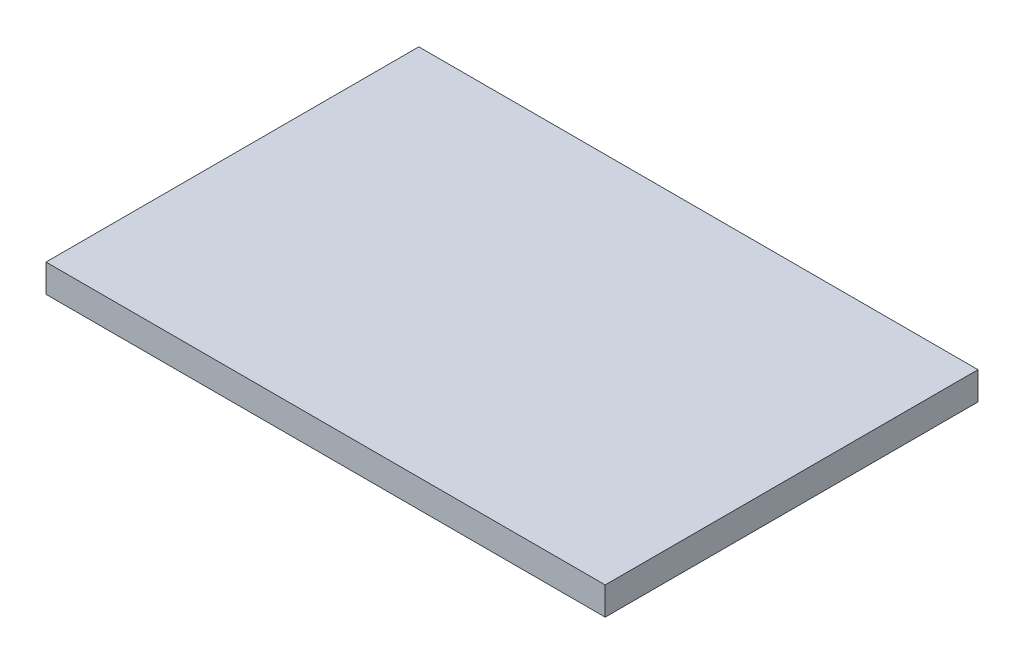
ISO-10303-21;
HEADER;
FILE_DESCRIPTION(('STEP AP214'),'2;1');
FILE_NAME('part.step','',(''),(''),'','','');
FILE_SCHEMA(('AUTOMOTIVE_DESIGN { 1 0 10303 214 1 1 1 1 }'));
ENDSEC;
DATA;
#1=APPLICATION_CONTEXT('core data for automotive mechanical design processes');
#2=APPLICATION_PROTOCOL_DEFINITION('international standard','automotive_design',2000,#1);
#3=PRODUCT_CONTEXT('',#1,'mechanical');
#4=PRODUCT('Part','Part','',(#3));
#5=PRODUCT_RELATED_PRODUCT_CATEGORY('part','',(#4));
#6=PRODUCT_DEFINITION_FORMATION('','',#4);
#7=PRODUCT_DEFINITION_CONTEXT('part definition',#1,'design');
#8=PRODUCT_DEFINITION('design','',#6,#7);
#9=PRODUCT_DEFINITION_SHAPE('','',#8);
#10=(LENGTH_UNIT() NAMED_UNIT(*) SI_UNIT(.MILLI.,.METRE.));
#11=(NAMED_UNIT(*) PLANE_ANGLE_UNIT() SI_UNIT($,.RADIAN.));
#12=(NAMED_UNIT(*) SI_UNIT($,.STERADIAN.) SOLID_ANGLE_UNIT());
#13=UNCERTAINTY_MEASURE_WITH_UNIT(LENGTH_MEASURE(1.E-05),#10,'distance_accuracy_value','');
#14=(GEOMETRIC_REPRESENTATION_CONTEXT(3) GLOBAL_UNCERTAINTY_ASSIGNED_CONTEXT((#13)) GLOBAL_UNIT_ASSIGNED_CONTEXT((#10,
#11,#12)) REPRESENTATION_CONTEXT('',''));
#15=CARTESIAN_POINT('',(0.,0.,0.));
#16=DIRECTION('',(0.,0.,1.));
#17=DIRECTION('',(1.,0.,0.));
#18=AXIS2_PLACEMENT_3D('',#15,#16,#17);
#19=CARTESIAN_POINT('',(15.,1.5,-10.));
#20=DIRECTION('',(-1.,0.,0.));
#21=DIRECTION('',(0.,0.,1.));
#22=AXIS2_PLACEMENT_3D('',#19,#20,#21);
#23=PLANE('',#22);
#24=DIRECTION('',(0.,0.,-1.));
#25=VECTOR('',#24,1.);
#26=CARTESIAN_POINT('',(15.,0.,-10.));
#27=LINE('',#26,#25);
#28=CARTESIAN_POINT('',(15.,0.,10.));
#29=VERTEX_POINT('',#28);
#30=CARTESIAN_POINT('',(15.,0.,-10.));
#31=VERTEX_POINT('',#30);
#32=EDGE_CURVE('E100',#29,#31,#27,.T.);
#33=ORIENTED_EDGE('',*,*,#32,.T.);
#34=DIRECTION('',(0.,-1.,0.));
#35=VECTOR('',#34,1.);
#36=CARTESIAN_POINT('',(15.,1.5,-10.));
#37=LINE('',#36,#35);
#38=CARTESIAN_POINT('',(15.,1.5,-10.));
#39=VERTEX_POINT('',#38);
#40=EDGE_CURVE('E11',#39,#31,#37,.T.);
#41=ORIENTED_EDGE('',*,*,#40,.F.);
#42=DIRECTION('',(0.,0.,-1.));
#43=VECTOR('',#42,1.);
#44=CARTESIAN_POINT('',(15.,1.5,-10.));
#45=LINE('',#44,#43);
#46=CARTESIAN_POINT('',(15.,1.5,10.));
#47=VERTEX_POINT('',#46);
#48=EDGE_CURVE('E88',#47,#39,#45,.T.);
#49=ORIENTED_EDGE('',*,*,#48,.F.);
#50=DIRECTION('',(0.,-1.,0.));
#51=VECTOR('',#50,1.);
#52=CARTESIAN_POINT('',(15.,1.5,10.));
#53=LINE('',#52,#51);
#54=EDGE_CURVE('E96',#47,#29,#53,.T.);
#55=ORIENTED_EDGE('',*,*,#54,.T.);
#56=EDGE_LOOP('',(#33,#41,#49,#55));
#57=FACE_BOUND('',#56,.T.);
#58=ADVANCED_FACE('F37',(#57),#23,.F.);
#59=CARTESIAN_POINT('',(-15.,1.5,-10.));
#60=DIRECTION('',(0.,0.,1.));
#61=DIRECTION('',(1.,0.,0.));
#62=AXIS2_PLACEMENT_3D('',#59,#60,#61);
#63=PLANE('',#62);
#64=DIRECTION('',(-1.,0.,0.));
#65=VECTOR('',#64,1.);
#66=CARTESIAN_POINT('',(-15.,0.,-10.));
#67=LINE('',#66,#65);
#68=CARTESIAN_POINT('',(-15.,0.,-10.));
#69=VERTEX_POINT('',#68);
#70=EDGE_CURVE('E92',#31,#69,#67,.T.);
#71=ORIENTED_EDGE('',*,*,#70,.T.);
#72=DIRECTION('',(0.,-1.,0.));
#73=VECTOR('',#72,1.);
#74=CARTESIAN_POINT('',(-15.,1.5,-10.));
#75=LINE('',#74,#73);
#76=CARTESIAN_POINT('',(-15.,1.5,-10.));
#77=VERTEX_POINT('',#76);
#78=EDGE_CURVE('E45',#77,#69,#75,.T.);
#79=ORIENTED_EDGE('',*,*,#78,.F.);
#80=DIRECTION('',(-1.,0.,0.));
#81=VECTOR('',#80,1.);
#82=CARTESIAN_POINT('',(-15.,1.5,-10.));
#83=LINE('',#82,#81);
#84=EDGE_CURVE('E83',#39,#77,#83,.T.);
#85=ORIENTED_EDGE('',*,*,#84,.F.);
#86=ORIENTED_EDGE('',*,*,#40,.T.);
#87=EDGE_LOOP('',(#71,#79,#85,#86));
#88=FACE_BOUND('',#87,.T.);
#89=ADVANCED_FACE('F91',(#88),#63,.F.);
#90=CARTESIAN_POINT('',(-15.,1.5,-10.));
#91=DIRECTION('',(1.,0.,0.));
#92=DIRECTION('',(0.,0.,-1.));
#93=AXIS2_PLACEMENT_3D('',#90,#91,#92);
#94=PLANE('',#93);
#95=DIRECTION('',(0.,0.,1.));
#96=VECTOR('',#95,1.);
#97=CARTESIAN_POINT('',(-15.,0.,-10.));
#98=LINE('',#97,#96);
#99=CARTESIAN_POINT('',(-15.,0.,10.));
#100=VERTEX_POINT('',#99);
#101=EDGE_CURVE('E70',#69,#100,#98,.T.);
#102=ORIENTED_EDGE('',*,*,#101,.T.);
#103=DIRECTION('',(0.,-1.,0.));
#104=VECTOR('',#103,1.);
#105=CARTESIAN_POINT('',(-15.,1.5,10.));
#106=LINE('',#105,#104);
#107=CARTESIAN_POINT('',(-15.,1.5,10.));
#108=VERTEX_POINT('',#107);
#109=EDGE_CURVE('E93',#108,#100,#106,.T.);
#110=ORIENTED_EDGE('',*,*,#109,.F.);
#111=DIRECTION('',(0.,0.,1.));
#112=VECTOR('',#111,1.);
#113=CARTESIAN_POINT('',(-15.,1.5,-10.));
#114=LINE('',#113,#112);
#115=EDGE_CURVE('E86',#77,#108,#114,.T.);
#116=ORIENTED_EDGE('',*,*,#115,.F.);
#117=ORIENTED_EDGE('',*,*,#78,.T.);
#118=EDGE_LOOP('',(#102,#110,#116,#117));
#119=FACE_BOUND('',#118,.T.);
#120=ADVANCED_FACE('F94',(#119),#94,.F.);
#121=CARTESIAN_POINT('',(-15.,1.5,10.));
#122=DIRECTION('',(0.,0.,-1.));
#123=DIRECTION('',(-1.,0.,0.));
#124=AXIS2_PLACEMENT_3D('',#121,#122,#123);
#125=PLANE('',#124);
#126=DIRECTION('',(1.,0.,0.));
#127=VECTOR('',#126,1.);
#128=CARTESIAN_POINT('',(-15.,0.,10.));
#129=LINE('',#128,#127);
#130=EDGE_CURVE('E76',#100,#29,#129,.T.);
#131=ORIENTED_EDGE('',*,*,#130,.T.);
#132=ORIENTED_EDGE('',*,*,#54,.F.);
#133=DIRECTION('',(1.,0.,0.));
#134=VECTOR('',#133,1.);
#135=CARTESIAN_POINT('',(-15.,1.5,10.));
#136=LINE('',#135,#134);
#137=EDGE_CURVE('E53',#108,#47,#136,.T.);
#138=ORIENTED_EDGE('',*,*,#137,.F.);
#139=ORIENTED_EDGE('',*,*,#109,.T.);
#140=EDGE_LOOP('',(#131,#132,#138,#139));
#141=FACE_BOUND('',#140,.T.);
#142=ADVANCED_FACE('F107',(#141),#125,.F.);
#143=CARTESIAN_POINT('',(0.,1.5,0.));
#144=DIRECTION('',(0.,1.,0.));
#145=DIRECTION('',(0.,0.,1.));
#146=AXIS2_PLACEMENT_3D('',#143,#144,#145);
#147=PLANE('',#146);
#148=ORIENTED_EDGE('',*,*,#48,.T.);
#149=ORIENTED_EDGE('',*,*,#84,.T.);
#150=ORIENTED_EDGE('',*,*,#115,.T.);
#151=ORIENTED_EDGE('',*,*,#137,.T.);
#152=EDGE_LOOP('',(#148,#149,#150,#151));
#153=FACE_BOUND('',#152,.T.);
#154=ADVANCED_FACE('F84',(#153),#147,.T.);
#155=CARTESIAN_POINT('',(0.,0.,0.));
#156=DIRECTION('',(0.,1.,0.));
#157=DIRECTION('',(0.,0.,1.));
#158=AXIS2_PLACEMENT_3D('',#155,#156,#157);
#159=PLANE('',#158);
#160=ORIENTED_EDGE('',*,*,#32,.F.);
#161=ORIENTED_EDGE('',*,*,#130,.F.);
#162=ORIENTED_EDGE('',*,*,#101,.F.);
#163=ORIENTED_EDGE('',*,*,#70,.F.);
#164=EDGE_LOOP('',(#160,#161,#162,#163));
#165=FACE_BOUND('',#164,.T.);
#166=ADVANCED_FACE('F110',(#165),#159,.F.);
#167=CLOSED_SHELL('',(#58,#89,#120,#142,#154,#166));
#168=MANIFOLD_SOLID_BREP('B2',#167);
#169=ADVANCED_BREP_SHAPE_REPRESENTATION('',(#18,#168),#14);
#170=SHAPE_DEFINITION_REPRESENTATION(#9,#169);
ENDSEC;
END-ISO-10303-21;
